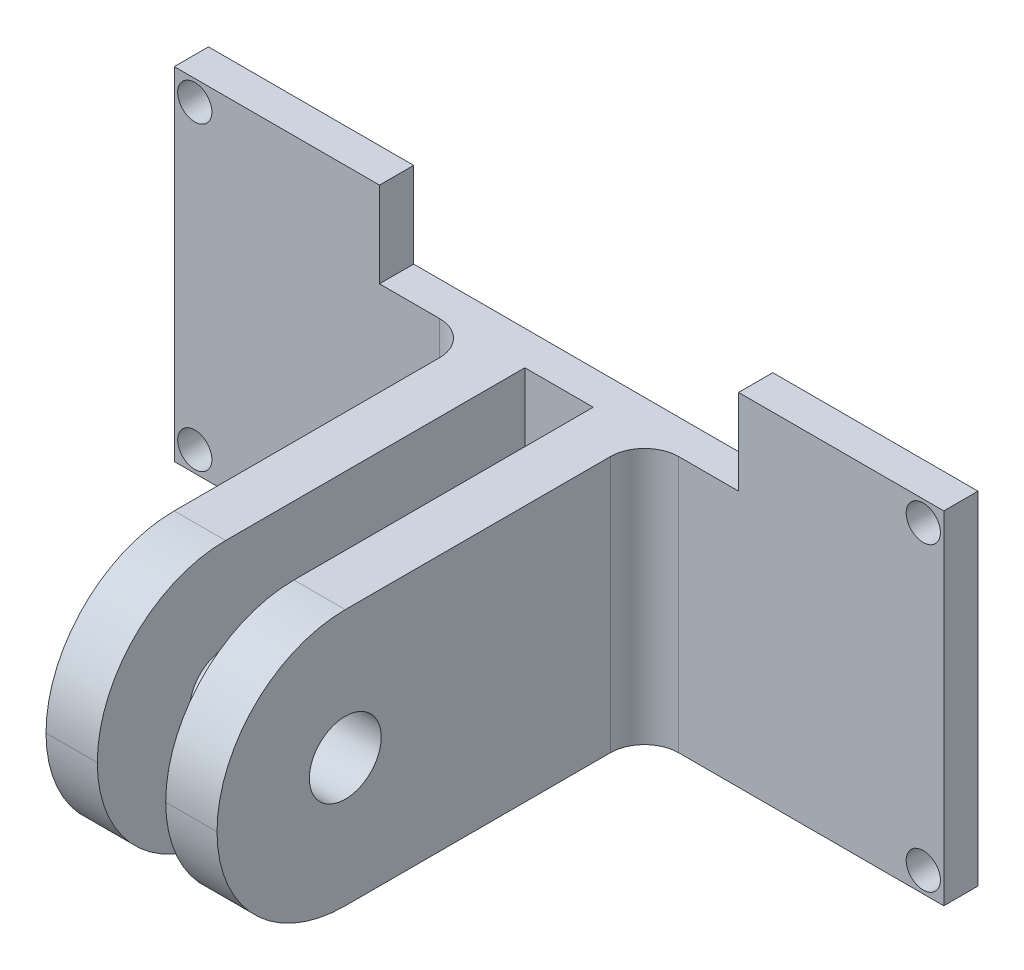
ISO-10303-21;
HEADER;
FILE_DESCRIPTION(('STEP AP214'),'2;1');
FILE_NAME('part.step','',(''),(''),'','','');
FILE_SCHEMA(('AUTOMOTIVE_DESIGN { 1 0 10303 214 1 1 1 1 }'));
ENDSEC;
DATA;
#1=APPLICATION_CONTEXT('core data for automotive mechanical design processes');
#2=APPLICATION_PROTOCOL_DEFINITION('international standard','automotive_design',2000,#1);
#3=PRODUCT_CONTEXT('',#1,'mechanical');
#4=PRODUCT('Part','Part','',(#3));
#5=PRODUCT_RELATED_PRODUCT_CATEGORY('part','',(#4));
#6=PRODUCT_DEFINITION_FORMATION('','',#4);
#7=PRODUCT_DEFINITION_CONTEXT('part definition',#1,'design');
#8=PRODUCT_DEFINITION('design','',#6,#7);
#9=PRODUCT_DEFINITION_SHAPE('','',#8);
#10=(LENGTH_UNIT() NAMED_UNIT(*) SI_UNIT(.MILLI.,.METRE.));
#11=(NAMED_UNIT(*) PLANE_ANGLE_UNIT() SI_UNIT($,.RADIAN.));
#12=(NAMED_UNIT(*) SI_UNIT($,.STERADIAN.) SOLID_ANGLE_UNIT());
#13=UNCERTAINTY_MEASURE_WITH_UNIT(LENGTH_MEASURE(1.E-05),#10,'distance_accuracy_value','');
#14=(GEOMETRIC_REPRESENTATION_CONTEXT(3) GLOBAL_UNCERTAINTY_ASSIGNED_CONTEXT((#13)) GLOBAL_UNIT_ASSIGNED_CONTEXT((#10,
#11,#12)) REPRESENTATION_CONTEXT('',''));
#15=CARTESIAN_POINT('',(0.,0.,0.));
#16=DIRECTION('',(0.,0.,1.));
#17=DIRECTION('',(1.,0.,0.));
#18=AXIS2_PLACEMENT_3D('',#15,#16,#17);
#19=CARTESIAN_POINT('',(0.,0.,2.));
#20=DIRECTION('',(0.,0.,1.));
#21=DIRECTION('',(1.,0.,0.));
#22=AXIS2_PLACEMENT_3D('',#19,#20,#21);
#23=PLANE('',#22);
#24=CARTESIAN_POINT('',(12.2666666666667,-7.86666666666667,2.));
#25=DIRECTION('',(0.,0.,1.));
#26=DIRECTION('',(1.,0.,0.));
#27=AXIS2_PLACEMENT_3D('',#24,#25,#26);
#28=CIRCLE('',#27,1.);
#29=CARTESIAN_POINT('',(13.2666666666667,-7.86666666666667,2.));
#30=VERTEX_POINT('',#29);
#31=EDGE_CURVE('E225',#30,#30,#28,.T.);
#32=ORIENTED_EDGE('',*,*,#31,.F.);
#33=EDGE_LOOP('',(#32));
#34=FACE_BOUND('',#33,.T.);
#35=CARTESIAN_POINT('',(12.2666666666667,9.73333333333333,2.));
#36=DIRECTION('',(0.,0.,1.));
#37=DIRECTION('',(1.,0.,0.));
#38=AXIS2_PLACEMENT_3D('',#35,#36,#37);
#39=CIRCLE('',#38,1.);
#40=CARTESIAN_POINT('',(13.2666666666667,9.73333333333333,2.));
#41=VERTEX_POINT('',#40);
#42=EDGE_CURVE('E231',#41,#41,#39,.T.);
#43=ORIENTED_EDGE('',*,*,#42,.F.);
#44=EDGE_LOOP('',(#43));
#45=FACE_BOUND('',#44,.T.);
#46=DIRECTION('',(-1.,0.,0.));
#47=VECTOR('',#46,1.);
#48=CARTESIAN_POINT('',(-19.5333333333333,5.93333333333333,2.));
#49=LINE('',#48,#47);
#50=CARTESIAN_POINT('',(1.46666666666666,5.93333333333333,2.));
#51=VERTEX_POINT('',#50);
#52=CARTESIAN_POINT('',(-2.03333333333333,5.93333333333333,2.));
#53=VERTEX_POINT('',#52);
#54=EDGE_CURVE('E192',#51,#53,#49,.T.);
#55=ORIENTED_EDGE('',*,*,#54,.T.);
#56=DIRECTION('',(0.,1.,0.));
#57=VECTOR('',#56,1.);
#58=CARTESIAN_POINT('',(-2.03333333333333,0.,2.));
#59=LINE('',#58,#57);
#60=CARTESIAN_POINT('',(-2.03333333333334,-9.06666666666667,2.));
#61=VERTEX_POINT('',#60);
#62=EDGE_CURVE('E339',#53,#61,#59,.F.);
#63=ORIENTED_EDGE('',*,*,#62,.T.);
#64=DIRECTION('',(1.,0.,0.));
#65=VECTOR('',#64,1.);
#66=CARTESIAN_POINT('',(-31.5333333333333,-9.06666666666667,2.));
#67=LINE('',#66,#65);
#68=CARTESIAN_POINT('',(13.4666666666667,-9.06666666666667,2.));
#69=VERTEX_POINT('',#68);
#70=EDGE_CURVE('E252',#61,#69,#67,.T.);
#71=ORIENTED_EDGE('',*,*,#70,.T.);
#72=DIRECTION('',(0.,1.,0.));
#73=VECTOR('',#72,1.);
#74=CARTESIAN_POINT('',(13.4666666666667,10.9333333333333,2.));
#75=LINE('',#74,#73);
#76=CARTESIAN_POINT('',(13.4666666666667,10.9333333333333,2.));
#77=VERTEX_POINT('',#76);
#78=EDGE_CURVE('E256',#69,#77,#75,.T.);
#79=ORIENTED_EDGE('',*,*,#78,.T.);
#80=DIRECTION('',(-1.,0.,0.));
#81=VECTOR('',#80,1.);
#82=CARTESIAN_POINT('',(1.46666666666666,10.9333333333333,2.));
#83=LINE('',#82,#81);
#84=CARTESIAN_POINT('',(1.46666666666666,10.9333333333333,2.));
#85=VERTEX_POINT('',#84);
#86=EDGE_CURVE('E258',#77,#85,#83,.T.);
#87=ORIENTED_EDGE('',*,*,#86,.T.);
#88=DIRECTION('',(0.,-1.,0.));
#89=VECTOR('',#88,1.);
#90=CARTESIAN_POINT('',(1.46666666666666,10.9333333333333,2.));
#91=LINE('',#90,#89);
#92=EDGE_CURVE('E260',#85,#51,#91,.T.);
#93=ORIENTED_EDGE('',*,*,#92,.T.);
#94=EDGE_LOOP('',(#55,#63,#71,#79,#87,#93));
#95=FACE_BOUND('',#94,.T.);
#96=ADVANCED_FACE('F34',(#34,#45,#95),#23,.T.);
#97=CARTESIAN_POINT('',(-11.0333333333333,-9.06666666666667,2.));
#98=VERTEX_POINT('',#97);
#99=CARTESIAN_POINT('',(-7.03333333333334,-9.06666666666667,2.));
#100=VERTEX_POINT('',#99);
#101=EDGE_CURVE('E198',#98,#100,#67,.T.);
#102=ORIENTED_EDGE('',*,*,#101,.T.);
#103=DIRECTION('',(0.,-1.,0.));
#104=VECTOR('',#103,1.);
#105=CARTESIAN_POINT('',(-7.03333333333333,5.93333333333333,2.));
#106=LINE('',#105,#104);
#107=CARTESIAN_POINT('',(-7.03333333333333,5.93333333333333,2.));
#108=VERTEX_POINT('',#107);
#109=EDGE_CURVE('E174',#108,#100,#106,.T.);
#110=ORIENTED_EDGE('',*,*,#109,.F.);
#111=CARTESIAN_POINT('',(-11.0333333333333,5.93333333333333,2.));
#112=VERTEX_POINT('',#111);
#113=EDGE_CURVE('E184',#108,#112,#49,.T.);
#114=ORIENTED_EDGE('',*,*,#113,.T.);
#115=DIRECTION('',(0.,1.,0.));
#116=VECTOR('',#115,1.);
#117=CARTESIAN_POINT('',(-11.0333333333333,5.93333333333333,2.));
#118=LINE('',#117,#116);
#119=EDGE_CURVE('E214',#98,#112,#118,.T.);
#120=ORIENTED_EDGE('',*,*,#119,.F.);
#121=EDGE_LOOP('',(#102,#110,#114,#120));
#122=FACE_BOUND('',#121,.T.);
#123=ADVANCED_FACE('F196',(#122),#23,.T.);
#124=CARTESIAN_POINT('',(-31.5333333333333,-9.06666666666667,2.));
#125=VERTEX_POINT('',#124);
#126=CARTESIAN_POINT('',(-16.0333333333333,-9.06666666666667,2.));
#127=VERTEX_POINT('',#126);
#128=EDGE_CURVE('E254',#125,#127,#67,.T.);
#129=ORIENTED_EDGE('',*,*,#128,.T.);
#130=DIRECTION('',(0.,-1.,0.));
#131=VECTOR('',#130,1.);
#132=CARTESIAN_POINT('',(-16.0333333333333,0.,2.));
#133=LINE('',#132,#131);
#134=CARTESIAN_POINT('',(-16.0333333333333,5.93333333333333,2.));
#135=VERTEX_POINT('',#134);
#136=EDGE_CURVE('E55',#127,#135,#133,.F.);
#137=ORIENTED_EDGE('',*,*,#136,.T.);
#138=CARTESIAN_POINT('',(-19.5333333333333,5.93333333333333,2.));
#139=VERTEX_POINT('',#138);
#140=EDGE_CURVE('E193',#135,#139,#49,.T.);
#141=ORIENTED_EDGE('',*,*,#140,.T.);
#142=DIRECTION('',(0.,1.,0.));
#143=VECTOR('',#142,1.);
#144=CARTESIAN_POINT('',(-19.5333333333333,10.9333333333333,2.));
#145=LINE('',#144,#143);
#146=CARTESIAN_POINT('',(-19.5333333333333,10.9333333333333,2.));
#147=VERTEX_POINT('',#146);
#148=EDGE_CURVE('E263',#139,#147,#145,.T.);
#149=ORIENTED_EDGE('',*,*,#148,.T.);
#150=DIRECTION('',(-1.,0.,0.));
#151=VECTOR('',#150,1.);
#152=CARTESIAN_POINT('',(-31.5333333333333,10.9333333333333,2.));
#153=LINE('',#152,#151);
#154=CARTESIAN_POINT('',(-31.5333333333333,10.9333333333333,2.));
#155=VERTEX_POINT('',#154);
#156=EDGE_CURVE('E265',#147,#155,#153,.T.);
#157=ORIENTED_EDGE('',*,*,#156,.T.);
#158=DIRECTION('',(0.,-1.,0.));
#159=VECTOR('',#158,1.);
#160=CARTESIAN_POINT('',(-31.5333333333333,10.9333333333333,2.));
#161=LINE('',#160,#159);
#162=EDGE_CURVE('E249',#155,#125,#161,.T.);
#163=ORIENTED_EDGE('',*,*,#162,.T.);
#164=EDGE_LOOP('',(#129,#137,#141,#149,#157,#163));
#165=FACE_BOUND('',#164,.T.);
#166=CARTESIAN_POINT('',(-30.3333333333333,9.73333333333333,2.));
#167=DIRECTION('',(0.,0.,1.));
#168=DIRECTION('',(1.,0.,0.));
#169=AXIS2_PLACEMENT_3D('',#166,#167,#168);
#170=CIRCLE('',#169,1.);
#171=CARTESIAN_POINT('',(-29.3333333333333,9.73333333333333,2.));
#172=VERTEX_POINT('',#171);
#173=EDGE_CURVE('E243',#172,#172,#170,.T.);
#174=ORIENTED_EDGE('',*,*,#173,.F.);
#175=EDGE_LOOP('',(#174));
#176=FACE_BOUND('',#175,.T.);
#177=CARTESIAN_POINT('',(-30.3333333333333,-7.86666666666667,2.));
#178=DIRECTION('',(0.,0.,1.));
#179=DIRECTION('',(1.,0.,0.));
#180=AXIS2_PLACEMENT_3D('',#177,#178,#179);
#181=CIRCLE('',#180,1.);
#182=CARTESIAN_POINT('',(-29.3333333333333,-7.86666666666667,2.));
#183=VERTEX_POINT('',#182);
#184=EDGE_CURVE('E237',#183,#183,#181,.T.);
#185=ORIENTED_EDGE('',*,*,#184,.F.);
#186=EDGE_LOOP('',(#185));
#187=FACE_BOUND('',#186,.T.);
#188=ADVANCED_FACE('F389',(#165,#176,#187),#23,.T.);
#189=CARTESIAN_POINT('',(0.,0.,0.));
#190=DIRECTION('',(0.,0.,1.));
#191=DIRECTION('',(1.,0.,0.));
#192=AXIS2_PLACEMENT_3D('',#189,#190,#191);
#193=PLANE('',#192);
#194=DIRECTION('',(0.,-1.,0.));
#195=VECTOR('',#194,1.);
#196=CARTESIAN_POINT('',(-31.5333333333333,10.9333333333333,0.));
#197=LINE('',#196,#195);
#198=CARTESIAN_POINT('',(-31.5333333333333,10.9333333333333,0.));
#199=VERTEX_POINT('',#198);
#200=CARTESIAN_POINT('',(-31.5333333333333,-9.06666666666667,0.));
#201=VERTEX_POINT('',#200);
#202=EDGE_CURVE('E246',#199,#201,#197,.T.);
#203=ORIENTED_EDGE('',*,*,#202,.F.);
#204=DIRECTION('',(-1.,0.,0.));
#205=VECTOR('',#204,1.);
#206=CARTESIAN_POINT('',(-31.5333333333333,10.9333333333333,0.));
#207=LINE('',#206,#205);
#208=CARTESIAN_POINT('',(-19.5333333333333,10.9333333333333,0.));
#209=VERTEX_POINT('',#208);
#210=EDGE_CURVE('E253',#209,#199,#207,.T.);
#211=ORIENTED_EDGE('',*,*,#210,.F.);
#212=DIRECTION('',(0.,1.,0.));
#213=VECTOR('',#212,1.);
#214=CARTESIAN_POINT('',(-19.5333333333333,10.9333333333333,0.));
#215=LINE('',#214,#213);
#216=CARTESIAN_POINT('',(-19.5333333333333,5.93333333333333,0.));
#217=VERTEX_POINT('',#216);
#218=EDGE_CURVE('E280',#217,#209,#215,.T.);
#219=ORIENTED_EDGE('',*,*,#218,.F.);
#220=DIRECTION('',(-1.,0.,0.));
#221=VECTOR('',#220,1.);
#222=CARTESIAN_POINT('',(-19.5333333333333,5.93333333333333,0.));
#223=LINE('',#222,#221);
#224=CARTESIAN_POINT('',(1.46666666666666,5.93333333333333,0.));
#225=VERTEX_POINT('',#224);
#226=EDGE_CURVE('E278',#225,#217,#223,.T.);
#227=ORIENTED_EDGE('',*,*,#226,.F.);
#228=DIRECTION('',(0.,-1.,0.));
#229=VECTOR('',#228,1.);
#230=CARTESIAN_POINT('',(1.46666666666666,10.9333333333333,0.));
#231=LINE('',#230,#229);
#232=CARTESIAN_POINT('',(1.46666666666666,10.9333333333333,0.));
#233=VERTEX_POINT('',#232);
#234=EDGE_CURVE('E276',#233,#225,#231,.T.);
#235=ORIENTED_EDGE('',*,*,#234,.F.);
#236=DIRECTION('',(-1.,0.,0.));
#237=VECTOR('',#236,1.);
#238=CARTESIAN_POINT('',(1.46666666666666,10.9333333333333,0.));
#239=LINE('',#238,#237);
#240=CARTESIAN_POINT('',(13.4666666666667,10.9333333333333,0.));
#241=VERTEX_POINT('',#240);
#242=EDGE_CURVE('E274',#241,#233,#239,.T.);
#243=ORIENTED_EDGE('',*,*,#242,.F.);
#244=DIRECTION('',(0.,1.,0.));
#245=VECTOR('',#244,1.);
#246=CARTESIAN_POINT('',(13.4666666666667,10.9333333333333,0.));
#247=LINE('',#246,#245);
#248=CARTESIAN_POINT('',(13.4666666666667,-9.06666666666667,0.));
#249=VERTEX_POINT('',#248);
#250=EDGE_CURVE('E272',#249,#241,#247,.T.);
#251=ORIENTED_EDGE('',*,*,#250,.F.);
#252=DIRECTION('',(1.,0.,0.));
#253=VECTOR('',#252,1.);
#254=CARTESIAN_POINT('',(-31.5333333333333,-9.06666666666667,0.));
#255=LINE('',#254,#253);
#256=EDGE_CURVE('E270',#201,#249,#255,.T.);
#257=ORIENTED_EDGE('',*,*,#256,.F.);
#258=EDGE_LOOP('',(#203,#211,#219,#227,#235,#243,#251,#257));
#259=FACE_BOUND('',#258,.T.);
#260=CARTESIAN_POINT('',(-30.3333333333333,9.73333333333333,0.));
#261=DIRECTION('',(0.,0.,1.));
#262=DIRECTION('',(1.,0.,0.));
#263=AXIS2_PLACEMENT_3D('',#260,#261,#262);
#264=CIRCLE('',#263,1.);
#265=CARTESIAN_POINT('',(-29.3333333333333,9.73333333333333,0.));
#266=VERTEX_POINT('',#265);
#267=EDGE_CURVE('E240',#266,#266,#264,.T.);
#268=ORIENTED_EDGE('',*,*,#267,.T.);
#269=EDGE_LOOP('',(#268));
#270=FACE_BOUND('',#269,.T.);
#271=CARTESIAN_POINT('',(-30.3333333333333,-7.86666666666667,0.));
#272=DIRECTION('',(0.,0.,1.));
#273=DIRECTION('',(1.,0.,0.));
#274=AXIS2_PLACEMENT_3D('',#271,#272,#273);
#275=CIRCLE('',#274,1.);
#276=CARTESIAN_POINT('',(-29.3333333333333,-7.86666666666667,0.));
#277=VERTEX_POINT('',#276);
#278=EDGE_CURVE('E234',#277,#277,#275,.T.);
#279=ORIENTED_EDGE('',*,*,#278,.T.);
#280=EDGE_LOOP('',(#279));
#281=FACE_BOUND('',#280,.T.);
#282=CARTESIAN_POINT('',(12.2666666666667,9.73333333333333,0.));
#283=DIRECTION('',(0.,0.,1.));
#284=DIRECTION('',(1.,0.,0.));
#285=AXIS2_PLACEMENT_3D('',#282,#283,#284);
#286=CIRCLE('',#285,1.);
#287=CARTESIAN_POINT('',(13.2666666666667,9.73333333333333,0.));
#288=VERTEX_POINT('',#287);
#289=EDGE_CURVE('E228',#288,#288,#286,.T.);
#290=ORIENTED_EDGE('',*,*,#289,.T.);
#291=EDGE_LOOP('',(#290));
#292=FACE_BOUND('',#291,.T.);
#293=CARTESIAN_POINT('',(12.2666666666667,-7.86666666666667,0.));
#294=DIRECTION('',(0.,0.,1.));
#295=DIRECTION('',(1.,0.,0.));
#296=AXIS2_PLACEMENT_3D('',#293,#294,#295);
#297=CIRCLE('',#296,1.);
#298=CARTESIAN_POINT('',(13.2666666666667,-7.86666666666667,0.));
#299=VERTEX_POINT('',#298);
#300=EDGE_CURVE('E224',#299,#299,#297,.T.);
#301=ORIENTED_EDGE('',*,*,#300,.T.);
#302=EDGE_LOOP('',(#301));
#303=FACE_BOUND('',#302,.T.);
#304=ADVANCED_FACE('F376',(#259,#270,#281,#292,#303),#193,.F.);
#305=CARTESIAN_POINT('',(-31.5333333333333,10.9333333333333,2.));
#306=DIRECTION('',(1.,0.,0.));
#307=DIRECTION('',(0.,0.,-1.));
#308=AXIS2_PLACEMENT_3D('',#305,#306,#307);
#309=PLANE('',#308);
#310=ORIENTED_EDGE('',*,*,#202,.T.);
#311=DIRECTION('',(0.,0.,-1.));
#312=VECTOR('',#311,1.);
#313=CARTESIAN_POINT('',(-31.5333333333333,-9.06666666666667,2.));
#314=LINE('',#313,#312);
#315=EDGE_CURVE('E303',#125,#201,#314,.T.);
#316=ORIENTED_EDGE('',*,*,#315,.F.);
#317=ORIENTED_EDGE('',*,*,#162,.F.);
#318=DIRECTION('',(0.,0.,-1.));
#319=VECTOR('',#318,1.);
#320=CARTESIAN_POINT('',(-31.5333333333333,10.9333333333333,2.));
#321=LINE('',#320,#319);
#322=EDGE_CURVE('E267',#155,#199,#321,.T.);
#323=ORIENTED_EDGE('',*,*,#322,.T.);
#324=EDGE_LOOP('',(#310,#316,#317,#323));
#325=FACE_BOUND('',#324,.T.);
#326=ADVANCED_FACE('F420',(#325),#309,.F.);
#327=CARTESIAN_POINT('',(-31.5333333333333,-9.06666666666667,2.));
#328=DIRECTION('',(0.,1.,0.));
#329=DIRECTION('',(0.,0.,1.));
#330=AXIS2_PLACEMENT_3D('',#327,#328,#329);
#331=PLANE('',#330);
#332=DIRECTION('',(0.,0.,-1.));
#333=VECTOR('',#332,1.);
#334=CARTESIAN_POINT('',(-4.03333333333333,-9.06666666666667,27.));
#335=LINE('',#334,#333);
#336=CARTESIAN_POINT('',(-4.03333333333333,-9.06666666666667,19.5));
#337=VERTEX_POINT('',#336);
#338=CARTESIAN_POINT('',(-4.03333333333333,-9.06666666666667,4.));
#339=VERTEX_POINT('',#338);
#340=EDGE_CURVE('E199',#337,#339,#335,.T.);
#341=ORIENTED_EDGE('',*,*,#340,.F.);
#342=DIRECTION('',(1.,0.,0.));
#343=VECTOR('',#342,1.);
#344=CARTESIAN_POINT('',(-7.03333333333333,-9.06666666666667,19.5));
#345=LINE('',#344,#343);
#346=CARTESIAN_POINT('',(-7.03333333333333,-9.06666666666667,19.5));
#347=VERTEX_POINT('',#346);
#348=EDGE_CURVE('E327',#337,#347,#345,.F.);
#349=ORIENTED_EDGE('',*,*,#348,.T.);
#350=DIRECTION('',(0.,0.,-1.));
#351=VECTOR('',#350,1.);
#352=CARTESIAN_POINT('',(-7.03333333333333,-9.06666666666667,27.));
#353=LINE('',#352,#351);
#354=EDGE_CURVE('E181',#347,#100,#353,.T.);
#355=ORIENTED_EDGE('',*,*,#354,.T.);
#356=ORIENTED_EDGE('',*,*,#101,.F.);
#357=DIRECTION('',(0.,0.,-1.));
#358=VECTOR('',#357,1.);
#359=CARTESIAN_POINT('',(-11.0333333333333,-9.06666666666667,27.));
#360=LINE('',#359,#358);
#361=CARTESIAN_POINT('',(-11.0333333333333,-9.06666666666667,19.5));
#362=VERTEX_POINT('',#361);
#363=EDGE_CURVE('E216',#362,#98,#360,.T.);
#364=ORIENTED_EDGE('',*,*,#363,.F.);
#365=DIRECTION('',(1.,0.,0.));
#366=VECTOR('',#365,1.);
#367=CARTESIAN_POINT('',(-14.0333333333333,-9.06666666666667,19.5));
#368=LINE('',#367,#366);
#369=CARTESIAN_POINT('',(-14.0333333333333,-9.06666666666667,19.5));
#370=VERTEX_POINT('',#369);
#371=EDGE_CURVE('E325',#362,#370,#368,.F.);
#372=ORIENTED_EDGE('',*,*,#371,.T.);
#373=DIRECTION('',(0.,0.,-1.));
#374=VECTOR('',#373,1.);
#375=CARTESIAN_POINT('',(-14.0333333333333,-9.06666666666667,27.));
#376=LINE('',#375,#374);
#377=CARTESIAN_POINT('',(-14.0333333333333,-9.06666666666667,4.));
#378=VERTEX_POINT('',#377);
#379=EDGE_CURVE('E218',#370,#378,#376,.T.);
#380=ORIENTED_EDGE('',*,*,#379,.T.);
#381=CARTESIAN_POINT('',(-16.0333333333333,-9.06666666666667,4.));
#382=DIRECTION('',(0.,1.,0.));
#383=DIRECTION('',(0.,0.,1.));
#384=AXIS2_PLACEMENT_3D('',#381,#382,#383);
#385=CIRCLE('',#384,2.);
#386=EDGE_CURVE('E42',#378,#127,#385,.T.);
#387=ORIENTED_EDGE('',*,*,#386,.T.);
#388=ORIENTED_EDGE('',*,*,#128,.F.);
#389=ORIENTED_EDGE('',*,*,#315,.T.);
#390=ORIENTED_EDGE('',*,*,#256,.T.);
#391=DIRECTION('',(0.,0.,-1.));
#392=VECTOR('',#391,1.);
#393=CARTESIAN_POINT('',(13.4666666666667,-9.06666666666667,2.));
#394=LINE('',#393,#392);
#395=EDGE_CURVE('E300',#69,#249,#394,.T.);
#396=ORIENTED_EDGE('',*,*,#395,.F.);
#397=ORIENTED_EDGE('',*,*,#70,.F.);
#398=CARTESIAN_POINT('',(-2.03333333333333,-9.06666666666666,4.));
#399=DIRECTION('',(0.,1.,0.));
#400=DIRECTION('',(0.,0.,1.));
#401=AXIS2_PLACEMENT_3D('',#398,#399,#400);
#402=CIRCLE('',#401,2.);
#403=EDGE_CURVE('E347',#61,#339,#402,.T.);
#404=ORIENTED_EDGE('',*,*,#403,.T.);
#405=EDGE_LOOP('',(#341,#349,#355,#356,#364,#372,#380,#387,#388,#389,#390,#396,#397,#404));
#406=FACE_BOUND('',#405,.T.);
#407=ADVANCED_FACE('F351',(#406),#331,.F.);
#408=CARTESIAN_POINT('',(13.4666666666667,10.9333333333333,2.));
#409=DIRECTION('',(-1.,0.,0.));
#410=DIRECTION('',(0.,0.,1.));
#411=AXIS2_PLACEMENT_3D('',#408,#409,#410);
#412=PLANE('',#411);
#413=ORIENTED_EDGE('',*,*,#250,.T.);
#414=DIRECTION('',(0.,0.,-1.));
#415=VECTOR('',#414,1.);
#416=CARTESIAN_POINT('',(13.4666666666667,10.9333333333333,2.));
#417=LINE('',#416,#415);
#418=EDGE_CURVE('E297',#77,#241,#417,.T.);
#419=ORIENTED_EDGE('',*,*,#418,.F.);
#420=ORIENTED_EDGE('',*,*,#78,.F.);
#421=ORIENTED_EDGE('',*,*,#395,.T.);
#422=EDGE_LOOP('',(#413,#419,#420,#421));
#423=FACE_BOUND('',#422,.T.);
#424=ADVANCED_FACE('F416',(#423),#412,.F.);
#425=CARTESIAN_POINT('',(1.46666666666666,10.9333333333333,2.));
#426=DIRECTION('',(0.,-1.,0.));
#427=DIRECTION('',(0.,0.,-1.));
#428=AXIS2_PLACEMENT_3D('',#425,#426,#427);
#429=PLANE('',#428);
#430=ORIENTED_EDGE('',*,*,#242,.T.);
#431=DIRECTION('',(0.,0.,-1.));
#432=VECTOR('',#431,1.);
#433=CARTESIAN_POINT('',(1.46666666666666,10.9333333333333,2.));
#434=LINE('',#433,#432);
#435=EDGE_CURVE('E294',#85,#233,#434,.T.);
#436=ORIENTED_EDGE('',*,*,#435,.F.);
#437=ORIENTED_EDGE('',*,*,#86,.F.);
#438=ORIENTED_EDGE('',*,*,#418,.T.);
#439=EDGE_LOOP('',(#430,#436,#437,#438));
#440=FACE_BOUND('',#439,.T.);
#441=ADVANCED_FACE('F418',(#440),#429,.F.);
#442=CARTESIAN_POINT('',(1.46666666666666,10.9333333333333,2.));
#443=DIRECTION('',(1.,0.,0.));
#444=DIRECTION('',(0.,0.,-1.));
#445=AXIS2_PLACEMENT_3D('',#442,#443,#444);
#446=PLANE('',#445);
#447=ORIENTED_EDGE('',*,*,#234,.T.);
#448=DIRECTION('',(0.,0.,-1.));
#449=VECTOR('',#448,1.);
#450=CARTESIAN_POINT('',(1.46666666666666,5.93333333333333,2.));
#451=LINE('',#450,#449);
#452=EDGE_CURVE('E291',#51,#225,#451,.T.);
#453=ORIENTED_EDGE('',*,*,#452,.F.);
#454=ORIENTED_EDGE('',*,*,#92,.F.);
#455=ORIENTED_EDGE('',*,*,#435,.T.);
#456=EDGE_LOOP('',(#447,#453,#454,#455));
#457=FACE_BOUND('',#456,.T.);
#458=ADVANCED_FACE('F369',(#457),#446,.F.);
#459=CARTESIAN_POINT('',(-19.5333333333333,5.93333333333333,2.));
#460=DIRECTION('',(0.,-1.,0.));
#461=DIRECTION('',(0.,0.,-1.));
#462=AXIS2_PLACEMENT_3D('',#459,#460,#461);
#463=PLANE('',#462);
#464=DIRECTION('',(0.,0.,-1.));
#465=VECTOR('',#464,1.);
#466=CARTESIAN_POINT('',(-7.03333333333333,5.93333333333333,27.));
#467=LINE('',#466,#465);
#468=CARTESIAN_POINT('',(-7.03333333333333,5.93333333333333,19.5));
#469=VERTEX_POINT('',#468);
#470=EDGE_CURVE('E169',#469,#108,#467,.T.);
#471=ORIENTED_EDGE('',*,*,#470,.F.);
#472=DIRECTION('',(-1.,0.,0.));
#473=VECTOR('',#472,1.);
#474=CARTESIAN_POINT('',(-4.03333333333333,5.93333333333333,19.5));
#475=LINE('',#474,#473);
#476=CARTESIAN_POINT('',(-4.03333333333333,5.93333333333333,19.5));
#477=VERTEX_POINT('',#476);
#478=EDGE_CURVE('E311',#469,#477,#475,.F.);
#479=ORIENTED_EDGE('',*,*,#478,.T.);
#480=DIRECTION('',(0.,0.,-1.));
#481=VECTOR('',#480,1.);
#482=CARTESIAN_POINT('',(-4.03333333333333,5.93333333333333,27.));
#483=LINE('',#482,#481);
#484=CARTESIAN_POINT('',(-4.03333333333333,5.93333333333333,4.));
#485=VERTEX_POINT('',#484);
#486=EDGE_CURVE('E180',#477,#485,#483,.T.);
#487=ORIENTED_EDGE('',*,*,#486,.T.);
#488=CARTESIAN_POINT('',(-2.03333333333333,5.93333333333333,4.));
#489=DIRECTION('',(0.,-1.,0.));
#490=DIRECTION('',(0.,0.,-1.));
#491=AXIS2_PLACEMENT_3D('',#488,#489,#490);
#492=CIRCLE('',#491,2.);
#493=EDGE_CURVE('E345',#485,#53,#492,.T.);
#494=ORIENTED_EDGE('',*,*,#493,.T.);
#495=ORIENTED_EDGE('',*,*,#54,.F.);
#496=ORIENTED_EDGE('',*,*,#452,.T.);
#497=ORIENTED_EDGE('',*,*,#226,.T.);
#498=DIRECTION('',(0.,0.,-1.));
#499=VECTOR('',#498,1.);
#500=CARTESIAN_POINT('',(-19.5333333333333,5.93333333333333,2.));
#501=LINE('',#500,#499);
#502=EDGE_CURVE('E288',#139,#217,#501,.T.);
#503=ORIENTED_EDGE('',*,*,#502,.F.);
#504=ORIENTED_EDGE('',*,*,#140,.F.);
#505=CARTESIAN_POINT('',(-16.0333333333333,5.93333333333333,4.));
#506=DIRECTION('',(0.,-1.,0.));
#507=DIRECTION('',(0.,0.,-1.));
#508=AXIS2_PLACEMENT_3D('',#505,#506,#507);
#509=CIRCLE('',#508,2.);
#510=CARTESIAN_POINT('',(-14.0333333333333,5.93333333333333,4.));
#511=VERTEX_POINT('',#510);
#512=EDGE_CURVE('E11',#135,#511,#509,.T.);
#513=ORIENTED_EDGE('',*,*,#512,.T.);
#514=DIRECTION('',(0.,0.,-1.));
#515=VECTOR('',#514,1.);
#516=CARTESIAN_POINT('',(-14.0333333333333,5.93333333333333,27.));
#517=LINE('',#516,#515);
#518=CARTESIAN_POINT('',(-14.0333333333333,5.93333333333333,19.5));
#519=VERTEX_POINT('',#518);
#520=EDGE_CURVE('E220',#519,#511,#517,.T.);
#521=ORIENTED_EDGE('',*,*,#520,.F.);
#522=DIRECTION('',(-1.,0.,0.));
#523=VECTOR('',#522,1.);
#524=CARTESIAN_POINT('',(-11.0333333333333,5.93333333333333,19.5));
#525=LINE('',#524,#523);
#526=CARTESIAN_POINT('',(-11.0333333333333,5.93333333333333,19.5));
#527=VERTEX_POINT('',#526);
#528=EDGE_CURVE('E309',#519,#527,#525,.F.);
#529=ORIENTED_EDGE('',*,*,#528,.T.);
#530=DIRECTION('',(0.,0.,-1.));
#531=VECTOR('',#530,1.);
#532=CARTESIAN_POINT('',(-11.0333333333333,5.93333333333333,27.));
#533=LINE('',#532,#531);
#534=EDGE_CURVE('E188',#527,#112,#533,.T.);
#535=ORIENTED_EDGE('',*,*,#534,.T.);
#536=ORIENTED_EDGE('',*,*,#113,.F.);
#537=EDGE_LOOP('',(#471,#479,#487,#494,#495,#496,#497,#503,#504,#513,#521,#529,#535,#536));
#538=FACE_BOUND('',#537,.T.);
#539=ADVANCED_FACE('F185',(#538),#463,.F.);
#540=CARTESIAN_POINT('',(-19.5333333333333,10.9333333333333,2.));
#541=DIRECTION('',(-1.,0.,0.));
#542=DIRECTION('',(0.,0.,1.));
#543=AXIS2_PLACEMENT_3D('',#540,#541,#542);
#544=PLANE('',#543);
#545=ORIENTED_EDGE('',*,*,#218,.T.);
#546=DIRECTION('',(0.,0.,-1.));
#547=VECTOR('',#546,1.);
#548=CARTESIAN_POINT('',(-19.5333333333333,10.9333333333333,2.));
#549=LINE('',#548,#547);
#550=EDGE_CURVE('E285',#147,#209,#549,.T.);
#551=ORIENTED_EDGE('',*,*,#550,.F.);
#552=ORIENTED_EDGE('',*,*,#148,.F.);
#553=ORIENTED_EDGE('',*,*,#502,.T.);
#554=EDGE_LOOP('',(#545,#551,#552,#553));
#555=FACE_BOUND('',#554,.T.);
#556=ADVANCED_FACE('F382',(#555),#544,.F.);
#557=CARTESIAN_POINT('',(-31.5333333333333,10.9333333333333,2.));
#558=DIRECTION('',(0.,-1.,0.));
#559=DIRECTION('',(0.,0.,-1.));
#560=AXIS2_PLACEMENT_3D('',#557,#558,#559);
#561=PLANE('',#560);
#562=ORIENTED_EDGE('',*,*,#210,.T.);
#563=ORIENTED_EDGE('',*,*,#322,.F.);
#564=ORIENTED_EDGE('',*,*,#156,.F.);
#565=ORIENTED_EDGE('',*,*,#550,.T.);
#566=EDGE_LOOP('',(#562,#563,#564,#565));
#567=FACE_BOUND('',#566,.T.);
#568=ADVANCED_FACE('F386',(#567),#561,.F.);
#569=CARTESIAN_POINT('',(-30.3333333333333,9.73333333333333,2.));
#570=DIRECTION('',(0.,0.,-1.));
#571=DIRECTION('',(-1.,0.,0.));
#572=AXIS2_PLACEMENT_3D('',#569,#570,#571);
#573=CYLINDRICAL_SURFACE('',#572,1.);
#574=ORIENTED_EDGE('',*,*,#173,.T.);
#575=EDGE_LOOP('',(#574));
#576=FACE_BOUND('',#575,.T.);
#577=ORIENTED_EDGE('',*,*,#267,.F.);
#578=EDGE_LOOP('',(#577));
#579=FACE_BOUND('',#578,.T.);
#580=ADVANCED_FACE('F497',(#576,#579),#573,.F.);
#581=CARTESIAN_POINT('',(-30.3333333333333,-7.86666666666667,2.));
#582=DIRECTION('',(0.,0.,-1.));
#583=DIRECTION('',(-1.,0.,0.));
#584=AXIS2_PLACEMENT_3D('',#581,#582,#583);
#585=CYLINDRICAL_SURFACE('',#584,1.);
#586=ORIENTED_EDGE('',*,*,#184,.T.);
#587=EDGE_LOOP('',(#586));
#588=FACE_BOUND('',#587,.T.);
#589=ORIENTED_EDGE('',*,*,#278,.F.);
#590=EDGE_LOOP('',(#589));
#591=FACE_BOUND('',#590,.T.);
#592=ADVANCED_FACE('F506',(#588,#591),#585,.F.);
#593=CARTESIAN_POINT('',(12.2666666666667,9.73333333333333,2.));
#594=DIRECTION('',(0.,0.,-1.));
#595=DIRECTION('',(-1.,0.,0.));
#596=AXIS2_PLACEMENT_3D('',#593,#594,#595);
#597=CYLINDRICAL_SURFACE('',#596,1.);
#598=ORIENTED_EDGE('',*,*,#42,.T.);
#599=EDGE_LOOP('',(#598));
#600=FACE_BOUND('',#599,.T.);
#601=ORIENTED_EDGE('',*,*,#289,.F.);
#602=EDGE_LOOP('',(#601));
#603=FACE_BOUND('',#602,.T.);
#604=ADVANCED_FACE('F515',(#600,#603),#597,.F.);
#605=CARTESIAN_POINT('',(12.2666666666667,-7.86666666666667,2.));
#606=DIRECTION('',(0.,0.,-1.));
#607=DIRECTION('',(-1.,0.,0.));
#608=AXIS2_PLACEMENT_3D('',#605,#606,#607);
#609=CYLINDRICAL_SURFACE('',#608,1.);
#610=ORIENTED_EDGE('',*,*,#31,.T.);
#611=EDGE_LOOP('',(#610));
#612=FACE_BOUND('',#611,.T.);
#613=ORIENTED_EDGE('',*,*,#300,.F.);
#614=EDGE_LOOP('',(#613));
#615=FACE_BOUND('',#614,.T.);
#616=ADVANCED_FACE('F525',(#612,#615),#609,.F.);
#617=CARTESIAN_POINT('',(-11.0333333333333,5.93333333333333,27.));
#618=DIRECTION('',(-1.,0.,0.));
#619=DIRECTION('',(0.,-1.,0.));
#620=AXIS2_PLACEMENT_3D('',#617,#618,#619);
#621=PLANE('',#620);
#622=CARTESIAN_POINT('',(-11.0333333333333,-1.56666666666667,19.5));
#623=DIRECTION('',(-1.,0.,0.));
#624=DIRECTION('',(0.,-1.,0.));
#625=AXIS2_PLACEMENT_3D('',#622,#623,#624);
#626=CIRCLE('',#625,2.1);
#627=CARTESIAN_POINT('',(-11.0333333333333,-3.66666666666667,19.5));
#628=VERTEX_POINT('',#627);
#629=EDGE_CURVE('E208',#628,#628,#626,.T.);
#630=ORIENTED_EDGE('',*,*,#629,.T.);
#631=EDGE_LOOP('',(#630));
#632=FACE_BOUND('',#631,.T.);
#633=ORIENTED_EDGE('',*,*,#534,.F.);
#634=CARTESIAN_POINT('',(-11.0333333333333,-1.56666666666667,19.5));
#635=DIRECTION('',(-1.,0.,0.));
#636=DIRECTION('',(0.,-1.,0.));
#637=AXIS2_PLACEMENT_3D('',#634,#635,#636);
#638=CIRCLE('',#637,7.5);
#639=CARTESIAN_POINT('',(-11.0333333333333,-1.56666666666667,27.));
#640=VERTEX_POINT('',#639);
#641=EDGE_CURVE('E323',#527,#640,#638,.F.);
#642=ORIENTED_EDGE('',*,*,#641,.T.);
#643=CARTESIAN_POINT('',(-11.0333333333333,-1.56666666666667,19.5));
#644=DIRECTION('',(-1.,0.,0.));
#645=DIRECTION('',(0.,-1.,0.));
#646=AXIS2_PLACEMENT_3D('',#643,#644,#645);
#647=CIRCLE('',#646,7.5);
#648=EDGE_CURVE('E321',#640,#362,#647,.F.);
#649=ORIENTED_EDGE('',*,*,#648,.T.);
#650=ORIENTED_EDGE('',*,*,#363,.T.);
#651=ORIENTED_EDGE('',*,*,#119,.T.);
#652=EDGE_LOOP('',(#633,#642,#649,#650,#651));
#653=FACE_BOUND('',#652,.T.);
#654=ADVANCED_FACE('F411',(#632,#653),#621,.F.);
#655=CARTESIAN_POINT('',(-14.0333333333333,5.93333333333333,27.));
#656=DIRECTION('',(1.,0.,0.));
#657=DIRECTION('',(0.,1.,0.));
#658=AXIS2_PLACEMENT_3D('',#655,#656,#657);
#659=PLANE('',#658);
#660=CARTESIAN_POINT('',(-14.0333333333333,-1.56666666666667,19.5));
#661=DIRECTION('',(1.,0.,0.));
#662=DIRECTION('',(0.,1.,0.));
#663=AXIS2_PLACEMENT_3D('',#660,#661,#662);
#664=CIRCLE('',#663,2.1);
#665=CARTESIAN_POINT('',(-14.0333333333333,0.533333333333335,19.5));
#666=VERTEX_POINT('',#665);
#667=EDGE_CURVE('E335',#666,#666,#664,.T.);
#668=ORIENTED_EDGE('',*,*,#667,.T.);
#669=EDGE_LOOP('',(#668));
#670=FACE_BOUND('',#669,.T.);
#671=ORIENTED_EDGE('',*,*,#520,.T.);
#672=DIRECTION('',(0.,-1.,0.));
#673=VECTOR('',#672,1.);
#674=CARTESIAN_POINT('',(-14.0333333333333,5.93333333333333,4.));
#675=LINE('',#674,#673);
#676=EDGE_CURVE('E341',#511,#378,#675,.T.);
#677=ORIENTED_EDGE('',*,*,#676,.T.);
#678=ORIENTED_EDGE('',*,*,#379,.F.);
#679=CARTESIAN_POINT('',(-14.0333333333333,-1.56666666666667,19.5));
#680=DIRECTION('',(1.,0.,0.));
#681=DIRECTION('',(0.,1.,0.));
#682=AXIS2_PLACEMENT_3D('',#679,#680,#681);
#683=CIRCLE('',#682,7.5);
#684=CARTESIAN_POINT('',(-14.0333333333333,-1.56666666666667,27.));
#685=VERTEX_POINT('',#684);
#686=EDGE_CURVE('E317',#370,#685,#683,.F.);
#687=ORIENTED_EDGE('',*,*,#686,.T.);
#688=CARTESIAN_POINT('',(-14.0333333333333,-1.56666666666667,19.5));
#689=DIRECTION('',(1.,0.,0.));
#690=DIRECTION('',(0.,1.,0.));
#691=AXIS2_PLACEMENT_3D('',#688,#689,#690);
#692=CIRCLE('',#691,7.5);
#693=EDGE_CURVE('E319',#685,#519,#692,.F.);
#694=ORIENTED_EDGE('',*,*,#693,.T.);
#695=EDGE_LOOP('',(#671,#677,#678,#687,#694));
#696=FACE_BOUND('',#695,.T.);
#697=ADVANCED_FACE('F398',(#670,#696),#659,.F.);
#698=CARTESIAN_POINT('',(-4.03333333333333,5.93333333333333,27.));
#699=DIRECTION('',(-1.,0.,0.));
#700=DIRECTION('',(0.,-1.,0.));
#701=AXIS2_PLACEMENT_3D('',#698,#699,#700);
#702=PLANE('',#701);
#703=CARTESIAN_POINT('',(-4.03333333333333,-1.56666666666666,19.5));
#704=DIRECTION('',(1.,0.,0.));
#705=DIRECTION('',(0.,1.,0.));
#706=AXIS2_PLACEMENT_3D('',#703,#704,#705);
#707=CIRCLE('',#706,2.1);
#708=CARTESIAN_POINT('',(-4.03333333333333,0.533333333333337,19.5));
#709=VERTEX_POINT('',#708);
#710=EDGE_CURVE('E336',#709,#709,#707,.T.);
#711=ORIENTED_EDGE('',*,*,#710,.F.);
#712=EDGE_LOOP('',(#711));
#713=FACE_BOUND('',#712,.T.);
#714=ORIENTED_EDGE('',*,*,#340,.T.);
#715=DIRECTION('',(0.,1.,0.));
#716=VECTOR('',#715,1.);
#717=CARTESIAN_POINT('',(-4.03333333333333,5.93333333333333,4.));
#718=LINE('',#717,#716);
#719=EDGE_CURVE('E328',#339,#485,#718,.T.);
#720=ORIENTED_EDGE('',*,*,#719,.T.);
#721=ORIENTED_EDGE('',*,*,#486,.F.);
#722=CARTESIAN_POINT('',(-4.03333333333333,-1.56666666666667,19.5));
#723=DIRECTION('',(-1.,0.,0.));
#724=DIRECTION('',(0.,-1.,0.));
#725=AXIS2_PLACEMENT_3D('',#722,#723,#724);
#726=CIRCLE('',#725,7.5);
#727=CARTESIAN_POINT('',(-4.03333333333333,-1.56666666666667,27.));
#728=VERTEX_POINT('',#727);
#729=EDGE_CURVE('E315',#477,#728,#726,.F.);
#730=ORIENTED_EDGE('',*,*,#729,.T.);
#731=CARTESIAN_POINT('',(-4.03333333333333,-1.56666666666667,19.5));
#732=DIRECTION('',(-1.,0.,0.));
#733=DIRECTION('',(0.,-1.,0.));
#734=AXIS2_PLACEMENT_3D('',#731,#732,#733);
#735=CIRCLE('',#734,7.5);
#736=EDGE_CURVE('E313',#728,#337,#735,.F.);
#737=ORIENTED_EDGE('',*,*,#736,.T.);
#738=EDGE_LOOP('',(#714,#720,#721,#730,#737));
#739=FACE_BOUND('',#738,.T.);
#740=ADVANCED_FACE('F358',(#713,#739),#702,.F.);
#741=CARTESIAN_POINT('',(-7.03333333333333,5.93333333333333,27.));
#742=DIRECTION('',(1.,0.,0.));
#743=DIRECTION('',(0.,1.,0.));
#744=AXIS2_PLACEMENT_3D('',#741,#742,#743);
#745=PLANE('',#744);
#746=CARTESIAN_POINT('',(-7.03333333333333,-1.56666666666666,19.5));
#747=DIRECTION('',(1.,0.,0.));
#748=DIRECTION('',(0.,1.,0.));
#749=AXIS2_PLACEMENT_3D('',#746,#747,#748);
#750=CIRCLE('',#749,2.1);
#751=CARTESIAN_POINT('',(-7.03333333333333,0.533333333333336,19.5));
#752=VERTEX_POINT('',#751);
#753=EDGE_CURVE('E332',#752,#752,#750,.T.);
#754=ORIENTED_EDGE('',*,*,#753,.T.);
#755=EDGE_LOOP('',(#754));
#756=FACE_BOUND('',#755,.T.);
#757=CARTESIAN_POINT('',(-7.03333333333333,-1.56666666666667,19.5));
#758=DIRECTION('',(1.,0.,0.));
#759=DIRECTION('',(0.,1.,0.));
#760=AXIS2_PLACEMENT_3D('',#757,#758,#759);
#761=CIRCLE('',#760,7.5);
#762=CARTESIAN_POINT('',(-7.03333333333333,-1.56666666666667,27.));
#763=VERTEX_POINT('',#762);
#764=EDGE_CURVE('E306',#347,#763,#761,.F.);
#765=ORIENTED_EDGE('',*,*,#764,.T.);
#766=CARTESIAN_POINT('',(-7.03333333333333,-1.56666666666667,19.5));
#767=DIRECTION('',(1.,0.,0.));
#768=DIRECTION('',(0.,1.,0.));
#769=AXIS2_PLACEMENT_3D('',#766,#767,#768);
#770=CIRCLE('',#769,7.5);
#771=EDGE_CURVE('E176',#763,#469,#770,.F.);
#772=ORIENTED_EDGE('',*,*,#771,.T.);
#773=ORIENTED_EDGE('',*,*,#470,.T.);
#774=ORIENTED_EDGE('',*,*,#109,.T.);
#775=ORIENTED_EDGE('',*,*,#354,.F.);
#776=EDGE_LOOP('',(#765,#772,#773,#774,#775));
#777=FACE_BOUND('',#776,.T.);
#778=ADVANCED_FACE('F171',(#756,#777),#745,.F.);
#779=CARTESIAN_POINT('',(0.,-1.56666666666667,19.5));
#780=DIRECTION('',(-1.,0.,0.));
#781=DIRECTION('',(0.,0.,1.));
#782=AXIS2_PLACEMENT_3D('',#779,#780,#781);
#783=CYLINDRICAL_SURFACE('',#782,7.5);
#784=ORIENTED_EDGE('',*,*,#348,.F.);
#785=ORIENTED_EDGE('',*,*,#736,.F.);
#786=DIRECTION('',(1.,0.,0.));
#787=VECTOR('',#786,1.);
#788=CARTESIAN_POINT('',(-4.03333333333333,-1.56666666666667,27.));
#789=LINE('',#788,#787);
#790=EDGE_CURVE('E200',#763,#728,#789,.T.);
#791=ORIENTED_EDGE('',*,*,#790,.F.);
#792=ORIENTED_EDGE('',*,*,#764,.F.);
#793=EDGE_LOOP('',(#784,#785,#791,#792));
#794=FACE_BOUND('',#793,.T.);
#795=ADVANCED_FACE('F546',(#794),#783,.T.);
#796=CARTESIAN_POINT('',(0.,-1.56666666666667,19.5));
#797=DIRECTION('',(1.,0.,0.));
#798=DIRECTION('',(0.,0.,-1.));
#799=AXIS2_PLACEMENT_3D('',#796,#797,#798);
#800=CYLINDRICAL_SURFACE('',#799,7.5);
#801=ORIENTED_EDGE('',*,*,#729,.F.);
#802=ORIENTED_EDGE('',*,*,#478,.F.);
#803=ORIENTED_EDGE('',*,*,#771,.F.);
#804=ORIENTED_EDGE('',*,*,#790,.T.);
#805=EDGE_LOOP('',(#801,#802,#803,#804));
#806=FACE_BOUND('',#805,.T.);
#807=ADVANCED_FACE('F551',(#806),#800,.T.);
#808=CARTESIAN_POINT('',(0.,-1.56666666666667,19.5));
#809=DIRECTION('',(-1.,0.,0.));
#810=DIRECTION('',(0.,0.,1.));
#811=AXIS2_PLACEMENT_3D('',#808,#809,#810);
#812=CYLINDRICAL_SURFACE('',#811,7.5);
#813=ORIENTED_EDGE('',*,*,#371,.F.);
#814=ORIENTED_EDGE('',*,*,#648,.F.);
#815=DIRECTION('',(1.,0.,0.));
#816=VECTOR('',#815,1.);
#817=CARTESIAN_POINT('',(-11.0333333333333,-1.56666666666667,27.));
#818=LINE('',#817,#816);
#819=EDGE_CURVE('E205',#685,#640,#818,.T.);
#820=ORIENTED_EDGE('',*,*,#819,.F.);
#821=ORIENTED_EDGE('',*,*,#686,.F.);
#822=EDGE_LOOP('',(#813,#814,#820,#821));
#823=FACE_BOUND('',#822,.T.);
#824=ADVANCED_FACE('F404',(#823),#812,.T.);
#825=CARTESIAN_POINT('',(0.,-1.56666666666667,19.5));
#826=DIRECTION('',(1.,0.,0.));
#827=DIRECTION('',(0.,0.,-1.));
#828=AXIS2_PLACEMENT_3D('',#825,#826,#827);
#829=CYLINDRICAL_SURFACE('',#828,7.5);
#830=ORIENTED_EDGE('',*,*,#641,.F.);
#831=ORIENTED_EDGE('',*,*,#528,.F.);
#832=ORIENTED_EDGE('',*,*,#693,.F.);
#833=ORIENTED_EDGE('',*,*,#819,.T.);
#834=EDGE_LOOP('',(#830,#831,#832,#833));
#835=FACE_BOUND('',#834,.T.);
#836=ADVANCED_FACE('F409',(#835),#829,.T.);
#837=CARTESIAN_POINT('',(-19.0333333333333,-1.56666666666667,19.5));
#838=DIRECTION('',(1.,0.,0.));
#839=DIRECTION('',(0.,1.,0.));
#840=AXIS2_PLACEMENT_3D('',#837,#838,#839);
#841=CYLINDRICAL_SURFACE('',#840,2.1);
#842=ORIENTED_EDGE('',*,*,#710,.T.);
#843=EDGE_LOOP('',(#842));
#844=FACE_BOUND('',#843,.T.);
#845=ORIENTED_EDGE('',*,*,#753,.F.);
#846=EDGE_LOOP('',(#845));
#847=FACE_BOUND('',#846,.T.);
#848=ADVANCED_FACE('F579',(#844,#847),#841,.F.);
#849=ORIENTED_EDGE('',*,*,#667,.F.);
#850=EDGE_LOOP('',(#849));
#851=FACE_BOUND('',#850,.T.);
#852=ORIENTED_EDGE('',*,*,#629,.F.);
#853=EDGE_LOOP('',(#852));
#854=FACE_BOUND('',#853,.T.);
#855=ADVANCED_FACE('F608',(#851,#854),#841,.F.);
#856=CARTESIAN_POINT('',(-2.03333333333333,5.93333333333333,4.));
#857=DIRECTION('',(0.,1.,0.));
#858=DIRECTION('',(-1.,0.,0.));
#859=AXIS2_PLACEMENT_3D('',#856,#857,#858);
#860=CYLINDRICAL_SURFACE('',#859,2.);
#861=ORIENTED_EDGE('',*,*,#403,.F.);
#862=ORIENTED_EDGE('',*,*,#62,.F.);
#863=ORIENTED_EDGE('',*,*,#493,.F.);
#864=ORIENTED_EDGE('',*,*,#719,.F.);
#865=EDGE_LOOP('',(#861,#862,#863,#864));
#866=FACE_BOUND('',#865,.T.);
#867=ADVANCED_FACE('F361',(#866),#860,.F.);
#868=CARTESIAN_POINT('',(-16.0333333333333,5.93333333333333,4.));
#869=DIRECTION('',(0.,-1.,0.));
#870=DIRECTION('',(1.,0.,0.));
#871=AXIS2_PLACEMENT_3D('',#868,#869,#870);
#872=CYLINDRICAL_SURFACE('',#871,2.);
#873=ORIENTED_EDGE('',*,*,#512,.F.);
#874=ORIENTED_EDGE('',*,*,#136,.F.);
#875=ORIENTED_EDGE('',*,*,#386,.F.);
#876=ORIENTED_EDGE('',*,*,#676,.F.);
#877=EDGE_LOOP('',(#873,#874,#875,#876));
#878=FACE_BOUND('',#877,.T.);
#879=ADVANCED_FACE('F36',(#878),#872,.F.);
#880=CLOSED_SHELL('',(#96,#123,#188,#304,#326,#407,#424,#441,#458,#539,#556,#568,#580,#592,#604,
#616,#654,#697,#740,#778,#795,#807,#824,#836,#848,#855,#867,#879));
#881=MANIFOLD_SOLID_BREP('B2',#880);
#882=ADVANCED_BREP_SHAPE_REPRESENTATION('',(#18,#881),#14);
#883=SHAPE_DEFINITION_REPRESENTATION(#9,#882);
ENDSEC;
END-ISO-10303-21;
